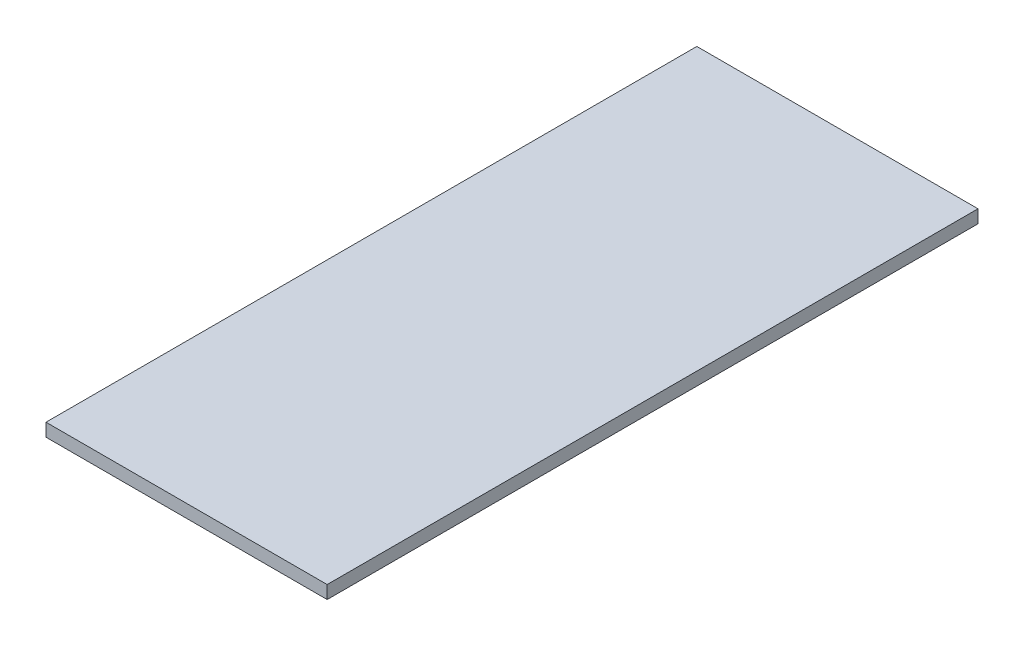
ISO-10303-21;
HEADER;
FILE_DESCRIPTION(('STEP AP214'),'2;1');
FILE_NAME('part.step','',(''),(''),'','','');
FILE_SCHEMA(('AUTOMOTIVE_DESIGN { 1 0 10303 214 1 1 1 1 }'));
ENDSEC;
DATA;
#1=APPLICATION_CONTEXT('core data for automotive mechanical design processes');
#2=APPLICATION_PROTOCOL_DEFINITION('international standard','automotive_design',2000,#1);
#3=PRODUCT_CONTEXT('',#1,'mechanical');
#4=PRODUCT('Part','Part','',(#3));
#5=PRODUCT_RELATED_PRODUCT_CATEGORY('part','',(#4));
#6=PRODUCT_DEFINITION_FORMATION('','',#4);
#7=PRODUCT_DEFINITION_CONTEXT('part definition',#1,'design');
#8=PRODUCT_DEFINITION('design','',#6,#7);
#9=PRODUCT_DEFINITION_SHAPE('','',#8);
#10=(LENGTH_UNIT() NAMED_UNIT(*) SI_UNIT(.MILLI.,.METRE.));
#11=(NAMED_UNIT(*) PLANE_ANGLE_UNIT() SI_UNIT($,.RADIAN.));
#12=(NAMED_UNIT(*) SI_UNIT($,.STERADIAN.) SOLID_ANGLE_UNIT());
#13=UNCERTAINTY_MEASURE_WITH_UNIT(LENGTH_MEASURE(1.E-05),#10,'distance_accuracy_value','');
#14=(GEOMETRIC_REPRESENTATION_CONTEXT(3) GLOBAL_UNCERTAINTY_ASSIGNED_CONTEXT((#13)) GLOBAL_UNIT_ASSIGNED_CONTEXT((#10,
#11,#12)) REPRESENTATION_CONTEXT('',''));
#15=CARTESIAN_POINT('',(0.,0.,0.));
#16=DIRECTION('',(0.,0.,1.));
#17=DIRECTION('',(1.,0.,0.));
#18=AXIS2_PLACEMENT_3D('',#15,#16,#17);
#19=CARTESIAN_POINT('',(10.8,1.,25.));
#20=DIRECTION('',(-1.,0.,0.));
#21=DIRECTION('',(0.,0.,1.));
#22=AXIS2_PLACEMENT_3D('',#19,#20,#21);
#23=PLANE('',#22);
#24=DIRECTION('',(0.,0.,-1.));
#25=VECTOR('',#24,1.);
#26=CARTESIAN_POINT('',(10.8,0.,25.));
#27=LINE('',#26,#25);
#28=CARTESIAN_POINT('',(10.8,0.,25.));
#29=VERTEX_POINT('',#28);
#30=CARTESIAN_POINT('',(10.8,0.,-25.));
#31=VERTEX_POINT('',#30);
#32=EDGE_CURVE('E97',#29,#31,#27,.T.);
#33=ORIENTED_EDGE('',*,*,#32,.T.);
#34=DIRECTION('',(0.,-1.,0.));
#35=VECTOR('',#34,1.);
#36=CARTESIAN_POINT('',(10.8,1.,-25.));
#37=LINE('',#36,#35);
#38=CARTESIAN_POINT('',(10.8,1.,-25.));
#39=VERTEX_POINT('',#38);
#40=EDGE_CURVE('E11',#39,#31,#37,.T.);
#41=ORIENTED_EDGE('',*,*,#40,.F.);
#42=DIRECTION('',(0.,0.,-1.));
#43=VECTOR('',#42,1.);
#44=CARTESIAN_POINT('',(10.8,1.,25.));
#45=LINE('',#44,#43);
#46=CARTESIAN_POINT('',(10.8,1.,25.));
#47=VERTEX_POINT('',#46);
#48=EDGE_CURVE('E85',#47,#39,#45,.T.);
#49=ORIENTED_EDGE('',*,*,#48,.F.);
#50=DIRECTION('',(0.,-1.,0.));
#51=VECTOR('',#50,1.);
#52=CARTESIAN_POINT('',(10.8,1.,25.));
#53=LINE('',#52,#51);
#54=EDGE_CURVE('E93',#47,#29,#53,.T.);
#55=ORIENTED_EDGE('',*,*,#54,.T.);
#56=EDGE_LOOP('',(#33,#41,#49,#55));
#57=FACE_BOUND('',#56,.T.);
#58=ADVANCED_FACE('F34',(#57),#23,.F.);
#59=CARTESIAN_POINT('',(-10.8,1.,-25.));
#60=DIRECTION('',(0.,0.,1.));
#61=DIRECTION('',(1.,0.,0.));
#62=AXIS2_PLACEMENT_3D('',#59,#60,#61);
#63=PLANE('',#62);
#64=DIRECTION('',(-1.,0.,0.));
#65=VECTOR('',#64,1.);
#66=CARTESIAN_POINT('',(-10.8,0.,-25.));
#67=LINE('',#66,#65);
#68=CARTESIAN_POINT('',(-10.8,0.,-25.));
#69=VERTEX_POINT('',#68);
#70=EDGE_CURVE('E89',#31,#69,#67,.T.);
#71=ORIENTED_EDGE('',*,*,#70,.T.);
#72=DIRECTION('',(0.,-1.,0.));
#73=VECTOR('',#72,1.);
#74=CARTESIAN_POINT('',(-10.8,1.,-25.));
#75=LINE('',#74,#73);
#76=CARTESIAN_POINT('',(-10.8,1.,-25.));
#77=VERTEX_POINT('',#76);
#78=EDGE_CURVE('E42',#77,#69,#75,.T.);
#79=ORIENTED_EDGE('',*,*,#78,.F.);
#80=DIRECTION('',(-1.,0.,0.));
#81=VECTOR('',#80,1.);
#82=CARTESIAN_POINT('',(-10.8,1.,-25.));
#83=LINE('',#82,#81);
#84=EDGE_CURVE('E80',#39,#77,#83,.T.);
#85=ORIENTED_EDGE('',*,*,#84,.F.);
#86=ORIENTED_EDGE('',*,*,#40,.T.);
#87=EDGE_LOOP('',(#71,#79,#85,#86));
#88=FACE_BOUND('',#87,.T.);
#89=ADVANCED_FACE('F88',(#88),#63,.F.);
#90=CARTESIAN_POINT('',(-10.8,1.,25.));
#91=DIRECTION('',(1.,0.,0.));
#92=DIRECTION('',(0.,0.,-1.));
#93=AXIS2_PLACEMENT_3D('',#90,#91,#92);
#94=PLANE('',#93);
#95=DIRECTION('',(0.,0.,1.));
#96=VECTOR('',#95,1.);
#97=CARTESIAN_POINT('',(-10.8,0.,25.));
#98=LINE('',#97,#96);
#99=CARTESIAN_POINT('',(-10.8,0.,25.));
#100=VERTEX_POINT('',#99);
#101=EDGE_CURVE('E67',#69,#100,#98,.T.);
#102=ORIENTED_EDGE('',*,*,#101,.T.);
#103=DIRECTION('',(0.,-1.,0.));
#104=VECTOR('',#103,1.);
#105=CARTESIAN_POINT('',(-10.8,1.,25.));
#106=LINE('',#105,#104);
#107=CARTESIAN_POINT('',(-10.8,1.,25.));
#108=VERTEX_POINT('',#107);
#109=EDGE_CURVE('E90',#108,#100,#106,.T.);
#110=ORIENTED_EDGE('',*,*,#109,.F.);
#111=DIRECTION('',(0.,0.,1.));
#112=VECTOR('',#111,1.);
#113=CARTESIAN_POINT('',(-10.8,1.,25.));
#114=LINE('',#113,#112);
#115=EDGE_CURVE('E83',#77,#108,#114,.T.);
#116=ORIENTED_EDGE('',*,*,#115,.F.);
#117=ORIENTED_EDGE('',*,*,#78,.T.);
#118=EDGE_LOOP('',(#102,#110,#116,#117));
#119=FACE_BOUND('',#118,.T.);
#120=ADVANCED_FACE('F91',(#119),#94,.F.);
#121=CARTESIAN_POINT('',(-10.8,1.,25.));
#122=DIRECTION('',(0.,0.,-1.));
#123=DIRECTION('',(-1.,0.,0.));
#124=AXIS2_PLACEMENT_3D('',#121,#122,#123);
#125=PLANE('',#124);
#126=DIRECTION('',(1.,0.,0.));
#127=VECTOR('',#126,1.);
#128=CARTESIAN_POINT('',(-10.8,0.,25.));
#129=LINE('',#128,#127);
#130=EDGE_CURVE('E73',#100,#29,#129,.T.);
#131=ORIENTED_EDGE('',*,*,#130,.T.);
#132=ORIENTED_EDGE('',*,*,#54,.F.);
#133=DIRECTION('',(1.,0.,0.));
#134=VECTOR('',#133,1.);
#135=CARTESIAN_POINT('',(-10.8,1.,25.));
#136=LINE('',#135,#134);
#137=EDGE_CURVE('E50',#108,#47,#136,.T.);
#138=ORIENTED_EDGE('',*,*,#137,.F.);
#139=ORIENTED_EDGE('',*,*,#109,.T.);
#140=EDGE_LOOP('',(#131,#132,#138,#139));
#141=FACE_BOUND('',#140,.T.);
#142=ADVANCED_FACE('F104',(#141),#125,.F.);
#143=CARTESIAN_POINT('',(0.,1.,0.));
#144=DIRECTION('',(0.,-1.,0.));
#145=DIRECTION('',(0.,0.,-1.));
#146=AXIS2_PLACEMENT_3D('',#143,#144,#145);
#147=PLANE('',#146);
#148=ORIENTED_EDGE('',*,*,#48,.T.);
#149=ORIENTED_EDGE('',*,*,#84,.T.);
#150=ORIENTED_EDGE('',*,*,#115,.T.);
#151=ORIENTED_EDGE('',*,*,#137,.T.);
#152=EDGE_LOOP('',(#148,#149,#150,#151));
#153=FACE_BOUND('',#152,.T.);
#154=ADVANCED_FACE('F81',(#153),#147,.F.);
#155=CARTESIAN_POINT('',(0.,0.,0.));
#156=DIRECTION('',(0.,-1.,0.));
#157=DIRECTION('',(0.,0.,-1.));
#158=AXIS2_PLACEMENT_3D('',#155,#156,#157);
#159=PLANE('',#158);
#160=ORIENTED_EDGE('',*,*,#32,.F.);
#161=ORIENTED_EDGE('',*,*,#130,.F.);
#162=ORIENTED_EDGE('',*,*,#101,.F.);
#163=ORIENTED_EDGE('',*,*,#70,.F.);
#164=EDGE_LOOP('',(#160,#161,#162,#163));
#165=FACE_BOUND('',#164,.T.);
#166=ADVANCED_FACE('F107',(#165),#159,.T.);
#167=CLOSED_SHELL('',(#58,#89,#120,#142,#154,#166));
#168=MANIFOLD_SOLID_BREP('B2',#167);
#169=ADVANCED_BREP_SHAPE_REPRESENTATION('',(#18,#168),#14);
#170=SHAPE_DEFINITION_REPRESENTATION(#9,#169);
ENDSEC;
END-ISO-10303-21;
